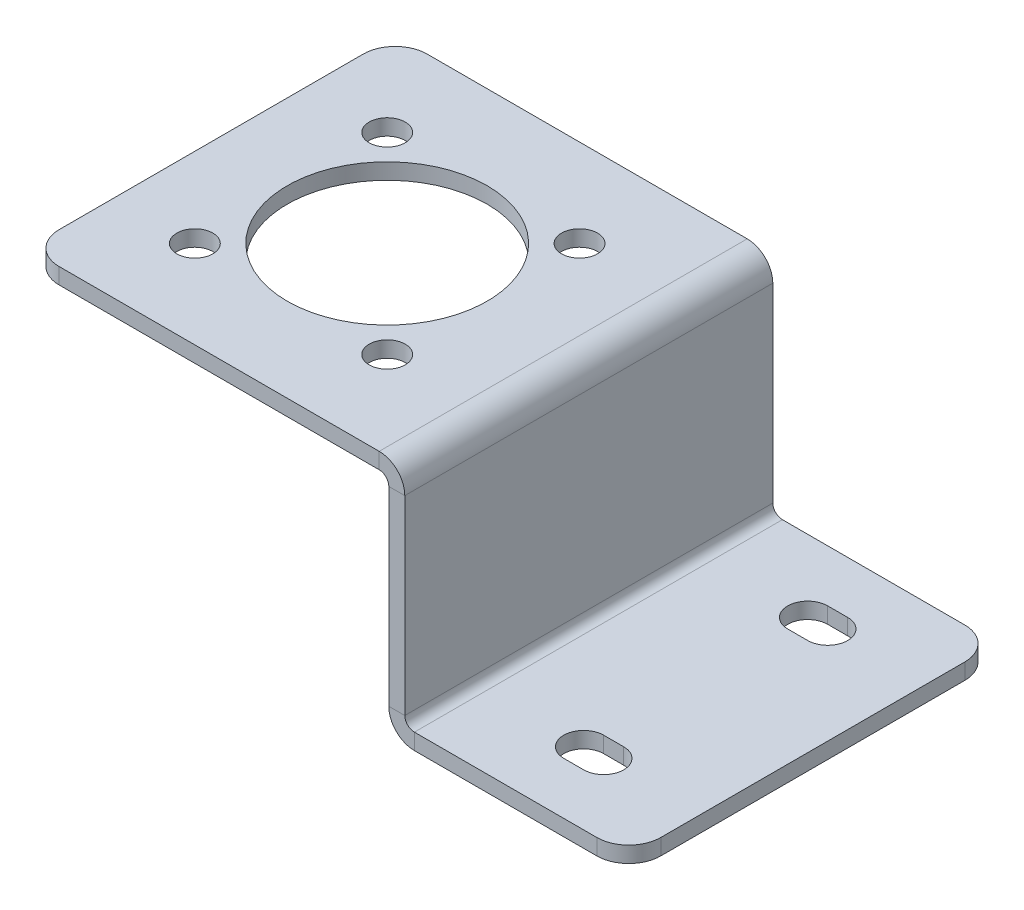
ISO-10303-21;
HEADER;
FILE_DESCRIPTION(('STEP AP214'),'2;1');
FILE_NAME('part.step','',(''),(''),'','','');
FILE_SCHEMA(('AUTOMOTIVE_DESIGN { 1 0 10303 214 1 1 1 1 }'));
ENDSEC;
DATA;
#1=APPLICATION_CONTEXT('core data for automotive mechanical design processes');
#2=APPLICATION_PROTOCOL_DEFINITION('international standard','automotive_design',2000,#1);
#3=PRODUCT_CONTEXT('',#1,'mechanical');
#4=PRODUCT('Part','Part','',(#3));
#5=PRODUCT_RELATED_PRODUCT_CATEGORY('part','',(#4));
#6=PRODUCT_DEFINITION_FORMATION('','',#4);
#7=PRODUCT_DEFINITION_CONTEXT('part definition',#1,'design');
#8=PRODUCT_DEFINITION('design','',#6,#7);
#9=PRODUCT_DEFINITION_SHAPE('','',#8);
#10=(LENGTH_UNIT() NAMED_UNIT(*) SI_UNIT(.MILLI.,.METRE.));
#11=(NAMED_UNIT(*) PLANE_ANGLE_UNIT() SI_UNIT($,.RADIAN.));
#12=(NAMED_UNIT(*) SI_UNIT($,.STERADIAN.) SOLID_ANGLE_UNIT());
#13=UNCERTAINTY_MEASURE_WITH_UNIT(LENGTH_MEASURE(1.E-05),#10,'distance_accuracy_value','');
#14=(GEOMETRIC_REPRESENTATION_CONTEXT(3) GLOBAL_UNCERTAINTY_ASSIGNED_CONTEXT((#13)) GLOBAL_UNIT_ASSIGNED_CONTEXT((#10,
#11,#12)) REPRESENTATION_CONTEXT('',''));
#15=CARTESIAN_POINT('',(0.,0.,0.));
#16=DIRECTION('',(0.,0.,1.));
#17=DIRECTION('',(1.,0.,0.));
#18=AXIS2_PLACEMENT_3D('',#15,#16,#17);
#19=CARTESIAN_POINT('',(-22.,-2.,23.));
#20=DIRECTION('',(0.,0.,1.));
#21=DIRECTION('',(1.,0.,0.));
#22=AXIS2_PLACEMENT_3D('',#19,#20,#21);
#23=PLANE('',#22);
#24=DIRECTION('',(1.,0.,0.));
#25=VECTOR('',#24,1.);
#26=CARTESIAN_POINT('',(-22.,0.,23.));
#27=LINE('',#26,#25);
#28=CARTESIAN_POINT('',(-18.,0.,23.));
#29=VERTEX_POINT('',#28);
#30=CARTESIAN_POINT('',(22.,0.,23.));
#31=VERTEX_POINT('',#30);
#32=EDGE_CURVE('E503',#29,#31,#27,.T.);
#33=ORIENTED_EDGE('',*,*,#32,.F.);
#34=DIRECTION('',(0.,1.,0.));
#35=VECTOR('',#34,1.);
#36=CARTESIAN_POINT('',(-18.,-2.,23.));
#37=LINE('',#36,#35);
#38=CARTESIAN_POINT('',(-18.,-2.,23.));
#39=VERTEX_POINT('',#38);
#40=EDGE_CURVE('E13',#29,#39,#37,.F.);
#41=ORIENTED_EDGE('',*,*,#40,.T.);
#42=DIRECTION('',(1.,0.,0.));
#43=VECTOR('',#42,1.);
#44=CARTESIAN_POINT('',(-22.,-2.,23.));
#45=LINE('',#44,#43);
#46=CARTESIAN_POINT('',(22.,-2.,23.));
#47=VERTEX_POINT('',#46);
#48=EDGE_CURVE('E510',#39,#47,#45,.T.);
#49=ORIENTED_EDGE('',*,*,#48,.T.);
#50=DIRECTION('',(0.,1.,0.));
#51=VECTOR('',#50,1.);
#52=CARTESIAN_POINT('',(22.,-2.,23.));
#53=LINE('',#52,#51);
#54=EDGE_CURVE('E527',#47,#31,#53,.T.);
#55=ORIENTED_EDGE('',*,*,#54,.T.);
#56=EDGE_LOOP('',(#33,#41,#49,#55));
#57=FACE_BOUND('',#56,.T.);
#58=ADVANCED_FACE('F86',(#57),#23,.T.);
#59=CARTESIAN_POINT('',(-22.,-2.,-23.));
#60=DIRECTION('',(-1.,0.,0.));
#61=DIRECTION('',(0.,0.,1.));
#62=AXIS2_PLACEMENT_3D('',#59,#60,#61);
#63=PLANE('',#62);
#64=DIRECTION('',(0.,0.,1.));
#65=VECTOR('',#64,1.);
#66=CARTESIAN_POINT('',(-22.,0.,-23.));
#67=LINE('',#66,#65);
#68=CARTESIAN_POINT('',(-22.,0.,-19.));
#69=VERTEX_POINT('',#68);
#70=CARTESIAN_POINT('',(-22.,0.,19.));
#71=VERTEX_POINT('',#70);
#72=EDGE_CURVE('E521',#69,#71,#67,.T.);
#73=ORIENTED_EDGE('',*,*,#72,.F.);
#74=DIRECTION('',(0.,1.,0.));
#75=VECTOR('',#74,1.);
#76=CARTESIAN_POINT('',(-22.,-2.,-19.));
#77=LINE('',#76,#75);
#78=CARTESIAN_POINT('',(-22.,-2.,-19.));
#79=VERTEX_POINT('',#78);
#80=EDGE_CURVE('E574',#69,#79,#77,.F.);
#81=ORIENTED_EDGE('',*,*,#80,.T.);
#82=DIRECTION('',(0.,0.,1.));
#83=VECTOR('',#82,1.);
#84=CARTESIAN_POINT('',(-22.,-2.,-23.));
#85=LINE('',#84,#83);
#86=CARTESIAN_POINT('',(-22.,-2.,19.));
#87=VERTEX_POINT('',#86);
#88=EDGE_CURVE('E507',#79,#87,#85,.T.);
#89=ORIENTED_EDGE('',*,*,#88,.T.);
#90=DIRECTION('',(0.,1.,0.));
#91=VECTOR('',#90,1.);
#92=CARTESIAN_POINT('',(-22.,-2.,19.));
#93=LINE('',#92,#91);
#94=EDGE_CURVE('E570',#87,#71,#93,.T.);
#95=ORIENTED_EDGE('',*,*,#94,.T.);
#96=EDGE_LOOP('',(#73,#81,#89,#95));
#97=FACE_BOUND('',#96,.T.);
#98=ADVANCED_FACE('F596',(#97),#63,.T.);
#99=CARTESIAN_POINT('',(-22.,-2.,-23.));
#100=DIRECTION('',(0.,0.,-1.));
#101=DIRECTION('',(-1.,0.,0.));
#102=AXIS2_PLACEMENT_3D('',#99,#100,#101);
#103=PLANE('',#102);
#104=DIRECTION('',(-1.,0.,0.));
#105=VECTOR('',#104,1.);
#106=CARTESIAN_POINT('',(-22.,-2.,-23.));
#107=LINE('',#106,#105);
#108=CARTESIAN_POINT('',(22.,-2.,-23.));
#109=VERTEX_POINT('',#108);
#110=CARTESIAN_POINT('',(-18.,-2.,-23.));
#111=VERTEX_POINT('',#110);
#112=EDGE_CURVE('E502',#109,#111,#107,.T.);
#113=ORIENTED_EDGE('',*,*,#112,.T.);
#114=DIRECTION('',(0.,1.,0.));
#115=VECTOR('',#114,1.);
#116=CARTESIAN_POINT('',(-18.,-2.,-23.));
#117=LINE('',#116,#115);
#118=CARTESIAN_POINT('',(-18.,0.,-23.));
#119=VERTEX_POINT('',#118);
#120=EDGE_CURVE('E560',#111,#119,#117,.T.);
#121=ORIENTED_EDGE('',*,*,#120,.T.);
#122=DIRECTION('',(-1.,0.,0.));
#123=VECTOR('',#122,1.);
#124=CARTESIAN_POINT('',(-22.,0.,-23.));
#125=LINE('',#124,#123);
#126=CARTESIAN_POINT('',(22.,0.,-23.));
#127=VERTEX_POINT('',#126);
#128=EDGE_CURVE('E517',#127,#119,#125,.T.);
#129=ORIENTED_EDGE('',*,*,#128,.F.);
#130=DIRECTION('',(0.,1.,0.));
#131=VECTOR('',#130,1.);
#132=CARTESIAN_POINT('',(22.,-2.,-23.));
#133=LINE('',#132,#131);
#134=EDGE_CURVE('E513',#109,#127,#133,.T.);
#135=ORIENTED_EDGE('',*,*,#134,.F.);
#136=EDGE_LOOP('',(#113,#121,#129,#135));
#137=FACE_BOUND('',#136,.T.);
#138=ADVANCED_FACE('F589',(#137),#103,.T.);
#139=CARTESIAN_POINT('',(0.,-2.,0.));
#140=DIRECTION('',(0.,1.,0.));
#141=DIRECTION('',(0.,0.,1.));
#142=AXIS2_PLACEMENT_3D('',#139,#140,#141);
#143=PLANE('',#142);
#144=CARTESIAN_POINT('',(-12.0208152801708,-2.,-12.0208152801701));
#145=DIRECTION('',(0.,1.,0.));
#146=DIRECTION('',(0.,0.,1.));
#147=AXIS2_PLACEMENT_3D('',#144,#145,#146);
#148=CIRCLE('',#147,2.25000000000102);
#149=CARTESIAN_POINT('',(-12.0208152801708,-2.,-9.77081528016909));
#150=VERTEX_POINT('',#149);
#151=EDGE_CURVE('E459',#150,#150,#148,.T.);
#152=ORIENTED_EDGE('',*,*,#151,.T.);
#153=EDGE_LOOP('',(#152));
#154=FACE_BOUND('',#153,.T.);
#155=CARTESIAN_POINT('',(-12.0208152801684,-2.,12.0208152801725));
#156=DIRECTION('',(0.,1.,0.));
#157=DIRECTION('',(0.,0.,1.));
#158=AXIS2_PLACEMENT_3D('',#155,#156,#157);
#159=CIRCLE('',#158,2.25000000000325);
#160=CARTESIAN_POINT('',(-12.0208152801684,-2.,14.2708152801758));
#161=VERTEX_POINT('',#160);
#162=EDGE_CURVE('E467',#161,#161,#159,.T.);
#163=ORIENTED_EDGE('',*,*,#162,.T.);
#164=EDGE_LOOP('',(#163));
#165=FACE_BOUND('',#164,.T.);
#166=CARTESIAN_POINT('',(12.0208152801742,-2.,12.0208152801701));
#167=DIRECTION('',(0.,1.,0.));
#168=DIRECTION('',(0.,0.,1.));
#169=AXIS2_PLACEMENT_3D('',#166,#167,#168);
#170=CIRCLE('',#169,2.25000000000249);
#171=CARTESIAN_POINT('',(12.0208152801742,-2.,14.2708152801726));
#172=VERTEX_POINT('',#171);
#173=EDGE_CURVE('E475',#172,#172,#170,.T.);
#174=ORIENTED_EDGE('',*,*,#173,.T.);
#175=EDGE_LOOP('',(#174));
#176=FACE_BOUND('',#175,.T.);
#177=CARTESIAN_POINT('',(12.0208152801718,-2.,-12.0208152801725));
#178=DIRECTION('',(0.,1.,0.));
#179=DIRECTION('',(0.,0.,1.));
#180=AXIS2_PLACEMENT_3D('',#177,#178,#179);
#181=CIRCLE('',#180,2.25000000000015);
#182=CARTESIAN_POINT('',(12.0208152801718,-2.,-9.77081528017235));
#183=VERTEX_POINT('',#182);
#184=EDGE_CURVE('E483',#183,#183,#181,.T.);
#185=ORIENTED_EDGE('',*,*,#184,.T.);
#186=EDGE_LOOP('',(#185));
#187=FACE_BOUND('',#186,.T.);
#188=CARTESIAN_POINT('',(0.,-2.,0.));
#189=DIRECTION('',(0.,1.,0.));
#190=DIRECTION('',(0.,0.,1.));
#191=AXIS2_PLACEMENT_3D('',#188,#189,#190);
#192=CIRCLE('',#191,12.5);
#193=CARTESIAN_POINT('',(0.,-2.,12.5));
#194=VERTEX_POINT('',#193);
#195=EDGE_CURVE('E491',#194,#194,#192,.T.);
#196=ORIENTED_EDGE('',*,*,#195,.T.);
#197=EDGE_LOOP('',(#196));
#198=FACE_BOUND('',#197,.T.);
#199=ORIENTED_EDGE('',*,*,#88,.F.);
#200=CARTESIAN_POINT('',(-18.,-2.,-19.));
#201=DIRECTION('',(0.,1.,0.));
#202=DIRECTION('',(0.,0.,1.));
#203=AXIS2_PLACEMENT_3D('',#200,#201,#202);
#204=CIRCLE('',#203,4.);
#205=EDGE_CURVE('E95',#79,#111,#204,.F.);
#206=ORIENTED_EDGE('',*,*,#205,.T.);
#207=ORIENTED_EDGE('',*,*,#112,.F.);
#208=DIRECTION('',(0.,0.,-1.));
#209=VECTOR('',#208,1.);
#210=CARTESIAN_POINT('',(22.,-2.,-23.));
#211=LINE('',#210,#209);
#212=EDGE_CURVE('E499',#47,#109,#211,.T.);
#213=ORIENTED_EDGE('',*,*,#212,.F.);
#214=ORIENTED_EDGE('',*,*,#48,.F.);
#215=CARTESIAN_POINT('',(-18.,-2.,19.));
#216=DIRECTION('',(0.,1.,0.));
#217=DIRECTION('',(0.,0.,1.));
#218=AXIS2_PLACEMENT_3D('',#215,#216,#217);
#219=CIRCLE('',#218,4.);
#220=EDGE_CURVE('E107',#39,#87,#219,.F.);
#221=ORIENTED_EDGE('',*,*,#220,.T.);
#222=EDGE_LOOP('',(#199,#206,#207,#213,#214,#221));
#223=FACE_BOUND('',#222,.T.);
#224=ADVANCED_FACE('F582',(#154,#165,#176,#187,#198,#223),#143,.F.);
#225=CARTESIAN_POINT('',(0.,0.,0.));
#226=DIRECTION('',(0.,1.,0.));
#227=DIRECTION('',(0.,0.,1.));
#228=AXIS2_PLACEMENT_3D('',#225,#226,#227);
#229=PLANE('',#228);
#230=CARTESIAN_POINT('',(-12.0208152801708,0.,-12.0208152801701));
#231=DIRECTION('',(0.,1.,0.));
#232=DIRECTION('',(0.,0.,1.));
#233=AXIS2_PLACEMENT_3D('',#230,#231,#232);
#234=CIRCLE('',#233,2.25000000000102);
#235=CARTESIAN_POINT('',(-12.0208152801708,0.,-9.77081528016909));
#236=VERTEX_POINT('',#235);
#237=EDGE_CURVE('E447',#236,#236,#234,.T.);
#238=ORIENTED_EDGE('',*,*,#237,.F.);
#239=EDGE_LOOP('',(#238));
#240=FACE_BOUND('',#239,.T.);
#241=CARTESIAN_POINT('',(-12.0208152801684,0.,12.0208152801725));
#242=DIRECTION('',(0.,1.,0.));
#243=DIRECTION('',(0.,0.,1.));
#244=AXIS2_PLACEMENT_3D('',#241,#242,#243);
#245=CIRCLE('',#244,2.25000000000325);
#246=CARTESIAN_POINT('',(-12.0208152801684,0.,14.2708152801758));
#247=VERTEX_POINT('',#246);
#248=EDGE_CURVE('E463',#247,#247,#245,.T.);
#249=ORIENTED_EDGE('',*,*,#248,.F.);
#250=EDGE_LOOP('',(#249));
#251=FACE_BOUND('',#250,.T.);
#252=CARTESIAN_POINT('',(12.0208152801742,0.,12.0208152801701));
#253=DIRECTION('',(0.,1.,0.));
#254=DIRECTION('',(0.,0.,1.));
#255=AXIS2_PLACEMENT_3D('',#252,#253,#254);
#256=CIRCLE('',#255,2.25000000000249);
#257=CARTESIAN_POINT('',(12.0208152801742,0.,14.2708152801726));
#258=VERTEX_POINT('',#257);
#259=EDGE_CURVE('E471',#258,#258,#256,.T.);
#260=ORIENTED_EDGE('',*,*,#259,.F.);
#261=EDGE_LOOP('',(#260));
#262=FACE_BOUND('',#261,.T.);
#263=CARTESIAN_POINT('',(12.0208152801718,0.,-12.0208152801725));
#264=DIRECTION('',(0.,1.,0.));
#265=DIRECTION('',(0.,0.,1.));
#266=AXIS2_PLACEMENT_3D('',#263,#264,#265);
#267=CIRCLE('',#266,2.25000000000015);
#268=CARTESIAN_POINT('',(12.0208152801718,0.,-9.77081528017235));
#269=VERTEX_POINT('',#268);
#270=EDGE_CURVE('E479',#269,#269,#267,.T.);
#271=ORIENTED_EDGE('',*,*,#270,.F.);
#272=EDGE_LOOP('',(#271));
#273=FACE_BOUND('',#272,.T.);
#274=CARTESIAN_POINT('',(0.,0.,0.));
#275=DIRECTION('',(0.,1.,0.));
#276=DIRECTION('',(0.,0.,1.));
#277=AXIS2_PLACEMENT_3D('',#274,#275,#276);
#278=CIRCLE('',#277,12.5);
#279=CARTESIAN_POINT('',(0.,0.,12.5));
#280=VERTEX_POINT('',#279);
#281=EDGE_CURVE('E487',#280,#280,#278,.T.);
#282=ORIENTED_EDGE('',*,*,#281,.F.);
#283=EDGE_LOOP('',(#282));
#284=FACE_BOUND('',#283,.T.);
#285=ORIENTED_EDGE('',*,*,#128,.T.);
#286=CARTESIAN_POINT('',(-18.,0.,-19.));
#287=DIRECTION('',(0.,1.,0.));
#288=DIRECTION('',(0.,0.,1.));
#289=AXIS2_PLACEMENT_3D('',#286,#287,#288);
#290=CIRCLE('',#289,4.);
#291=EDGE_CURVE('E567',#119,#69,#290,.T.);
#292=ORIENTED_EDGE('',*,*,#291,.T.);
#293=ORIENTED_EDGE('',*,*,#72,.T.);
#294=CARTESIAN_POINT('',(-18.,0.,19.));
#295=DIRECTION('',(0.,1.,0.));
#296=DIRECTION('',(0.,0.,1.));
#297=AXIS2_PLACEMENT_3D('',#294,#295,#296);
#298=CIRCLE('',#297,4.);
#299=EDGE_CURVE('E564',#71,#29,#298,.T.);
#300=ORIENTED_EDGE('',*,*,#299,.T.);
#301=ORIENTED_EDGE('',*,*,#32,.T.);
#302=DIRECTION('',(0.,0.,-1.));
#303=VECTOR('',#302,1.);
#304=CARTESIAN_POINT('',(22.,0.,-23.));
#305=LINE('',#304,#303);
#306=EDGE_CURVE('E495',#31,#127,#305,.T.);
#307=ORIENTED_EDGE('',*,*,#306,.T.);
#308=EDGE_LOOP('',(#285,#292,#293,#300,#301,#307));
#309=FACE_BOUND('',#308,.T.);
#310=ADVANCED_FACE('F594',(#240,#251,#262,#273,#284,#309),#229,.T.);
#311=CARTESIAN_POINT('',(0.,-2.,0.));
#312=DIRECTION('',(0.,1.,0.));
#313=DIRECTION('',(0.,0.,1.));
#314=AXIS2_PLACEMENT_3D('',#311,#312,#313);
#315=CYLINDRICAL_SURFACE('',#314,12.5);
#316=ORIENTED_EDGE('',*,*,#195,.F.);
#317=EDGE_LOOP('',(#316));
#318=FACE_BOUND('',#317,.T.);
#319=ORIENTED_EDGE('',*,*,#281,.T.);
#320=EDGE_LOOP('',(#319));
#321=FACE_BOUND('',#320,.T.);
#322=ADVANCED_FACE('F959',(#318,#321),#315,.F.);
#323=CARTESIAN_POINT('',(12.0208152801718,-2.,-12.0208152801725));
#324=DIRECTION('',(0.,1.,0.));
#325=DIRECTION('',(0.,0.,1.));
#326=AXIS2_PLACEMENT_3D('',#323,#324,#325);
#327=CYLINDRICAL_SURFACE('',#326,2.25000000000015);
#328=ORIENTED_EDGE('',*,*,#184,.F.);
#329=EDGE_LOOP('',(#328));
#330=FACE_BOUND('',#329,.T.);
#331=ORIENTED_EDGE('',*,*,#270,.T.);
#332=EDGE_LOOP('',(#331));
#333=FACE_BOUND('',#332,.T.);
#334=ADVANCED_FACE('F949',(#330,#333),#327,.F.);
#335=CARTESIAN_POINT('',(12.0208152801742,-2.,12.0208152801701));
#336=DIRECTION('',(0.,1.,0.));
#337=DIRECTION('',(0.,0.,1.));
#338=AXIS2_PLACEMENT_3D('',#335,#336,#337);
#339=CYLINDRICAL_SURFACE('',#338,2.25000000000249);
#340=ORIENTED_EDGE('',*,*,#173,.F.);
#341=EDGE_LOOP('',(#340));
#342=FACE_BOUND('',#341,.T.);
#343=ORIENTED_EDGE('',*,*,#259,.T.);
#344=EDGE_LOOP('',(#343));
#345=FACE_BOUND('',#344,.T.);
#346=ADVANCED_FACE('F939',(#342,#345),#339,.F.);
#347=CARTESIAN_POINT('',(-12.0208152801684,-2.,12.0208152801725));
#348=DIRECTION('',(0.,1.,0.));
#349=DIRECTION('',(0.,0.,1.));
#350=AXIS2_PLACEMENT_3D('',#347,#348,#349);
#351=CYLINDRICAL_SURFACE('',#350,2.25000000000325);
#352=ORIENTED_EDGE('',*,*,#162,.F.);
#353=EDGE_LOOP('',(#352));
#354=FACE_BOUND('',#353,.T.);
#355=ORIENTED_EDGE('',*,*,#248,.T.);
#356=EDGE_LOOP('',(#355));
#357=FACE_BOUND('',#356,.T.);
#358=ADVANCED_FACE('F929',(#354,#357),#351,.F.);
#359=CARTESIAN_POINT('',(-12.0208152801708,-2.,-12.0208152801701));
#360=DIRECTION('',(0.,1.,0.));
#361=DIRECTION('',(0.,0.,1.));
#362=AXIS2_PLACEMENT_3D('',#359,#360,#361);
#363=CYLINDRICAL_SURFACE('',#362,2.25000000000102);
#364=ORIENTED_EDGE('',*,*,#151,.F.);
#365=EDGE_LOOP('',(#364));
#366=FACE_BOUND('',#365,.T.);
#367=ORIENTED_EDGE('',*,*,#237,.T.);
#368=EDGE_LOOP('',(#367));
#369=FACE_BOUND('',#368,.T.);
#370=ADVANCED_FACE('F919',(#366,#369),#363,.F.);
#371=CARTESIAN_POINT('',(22.,-3.2,-23.));
#372=DIRECTION('',(0.,0.,-1.));
#373=DIRECTION('',(-1.,0.,0.));
#374=AXIS2_PLACEMENT_3D('',#371,#372,#373);
#375=PLANE('',#374);
#376=DIRECTION('',(-1.,0.,0.));
#377=VECTOR('',#376,1.);
#378=CARTESIAN_POINT('',(25.2,-3.19999999999999,-23.));
#379=LINE('',#378,#377);
#380=CARTESIAN_POINT('',(23.2,-3.2,-23.));
#381=VERTEX_POINT('',#380);
#382=CARTESIAN_POINT('',(25.2,-3.19999999999999,-23.));
#383=VERTEX_POINT('',#382);
#384=EDGE_CURVE('E388',#381,#383,#379,.F.);
#385=ORIENTED_EDGE('',*,*,#384,.F.);
#386=CARTESIAN_POINT('',(22.,-3.2,-23.));
#387=DIRECTION('',(0.,0.,1.));
#388=DIRECTION('',(1.,0.,0.));
#389=AXIS2_PLACEMENT_3D('',#386,#387,#388);
#390=CIRCLE('',#389,1.2);
#391=EDGE_CURVE('E452',#109,#381,#390,.F.);
#392=ORIENTED_EDGE('',*,*,#391,.F.);
#393=ORIENTED_EDGE('',*,*,#134,.T.);
#394=CARTESIAN_POINT('',(22.,-3.2,-23.));
#395=DIRECTION('',(0.,0.,1.));
#396=DIRECTION('',(1.,0.,0.));
#397=AXIS2_PLACEMENT_3D('',#394,#395,#396);
#398=CIRCLE('',#397,3.2);
#399=EDGE_CURVE('E443',#127,#383,#398,.F.);
#400=ORIENTED_EDGE('',*,*,#399,.T.);
#401=EDGE_LOOP('',(#385,#392,#393,#400));
#402=FACE_BOUND('',#401,.T.);
#403=ADVANCED_FACE('F910',(#402),#375,.T.);
#404=CARTESIAN_POINT('',(22.,-3.2,23.));
#405=DIRECTION('',(0.,0.,-1.));
#406=DIRECTION('',(-1.,0.,0.));
#407=AXIS2_PLACEMENT_3D('',#404,#405,#406);
#408=PLANE('',#407);
#409=CARTESIAN_POINT('',(22.,-3.2,23.));
#410=DIRECTION('',(0.,0.,1.));
#411=DIRECTION('',(1.,0.,0.));
#412=AXIS2_PLACEMENT_3D('',#409,#410,#411);
#413=CIRCLE('',#412,1.2);
#414=CARTESIAN_POINT('',(23.2,-3.2,23.));
#415=VERTEX_POINT('',#414);
#416=EDGE_CURVE('E404',#415,#47,#413,.T.);
#417=ORIENTED_EDGE('',*,*,#416,.F.);
#418=DIRECTION('',(-1.,0.,0.));
#419=VECTOR('',#418,1.);
#420=CARTESIAN_POINT('',(23.2,-3.2,23.));
#421=LINE('',#420,#419);
#422=CARTESIAN_POINT('',(25.2,-3.19999999999999,23.));
#423=VERTEX_POINT('',#422);
#424=EDGE_CURVE('E433',#415,#423,#421,.F.);
#425=ORIENTED_EDGE('',*,*,#424,.T.);
#426=CARTESIAN_POINT('',(22.,-3.2,23.));
#427=DIRECTION('',(0.,0.,1.));
#428=DIRECTION('',(1.,0.,0.));
#429=AXIS2_PLACEMENT_3D('',#426,#427,#428);
#430=CIRCLE('',#429,3.2);
#431=EDGE_CURVE('E448',#423,#31,#430,.T.);
#432=ORIENTED_EDGE('',*,*,#431,.T.);
#433=ORIENTED_EDGE('',*,*,#54,.F.);
#434=EDGE_LOOP('',(#417,#425,#432,#433));
#435=FACE_BOUND('',#434,.T.);
#436=ADVANCED_FACE('F603',(#435),#408,.F.);
#437=CARTESIAN_POINT('',(22.,-3.2,23.));
#438=DIRECTION('',(0.,0.,1.));
#439=DIRECTION('',(1.,0.,0.));
#440=AXIS2_PLACEMENT_3D('',#437,#438,#439);
#441=CYLINDRICAL_SURFACE('',#440,3.2);
#442=ORIENTED_EDGE('',*,*,#306,.F.);
#443=ORIENTED_EDGE('',*,*,#431,.F.);
#444=DIRECTION('',(0.,0.,1.));
#445=VECTOR('',#444,1.);
#446=CARTESIAN_POINT('',(25.2,-3.19999999999999,-23.));
#447=LINE('',#446,#445);
#448=EDGE_CURVE('E430',#423,#383,#447,.F.);
#449=ORIENTED_EDGE('',*,*,#448,.T.);
#450=ORIENTED_EDGE('',*,*,#399,.F.);
#451=EDGE_LOOP('',(#442,#443,#449,#450));
#452=FACE_BOUND('',#451,.T.);
#453=ADVANCED_FACE('F892',(#452),#441,.T.);
#454=CARTESIAN_POINT('',(22.,-3.2,23.));
#455=DIRECTION('',(0.,0.,1.));
#456=DIRECTION('',(1.,0.,0.));
#457=AXIS2_PLACEMENT_3D('',#454,#455,#456);
#458=CYLINDRICAL_SURFACE('',#457,1.2);
#459=ORIENTED_EDGE('',*,*,#212,.T.);
#460=ORIENTED_EDGE('',*,*,#391,.T.);
#461=DIRECTION('',(0.,0.,1.));
#462=VECTOR('',#461,1.);
#463=CARTESIAN_POINT('',(23.2,-3.2,-23.));
#464=LINE('',#463,#462);
#465=EDGE_CURVE('E437',#381,#415,#464,.T.);
#466=ORIENTED_EDGE('',*,*,#465,.T.);
#467=ORIENTED_EDGE('',*,*,#416,.T.);
#468=EDGE_LOOP('',(#459,#460,#466,#467));
#469=FACE_BOUND('',#468,.T.);
#470=ADVANCED_FACE('F606',(#469),#458,.F.);
#471=CARTESIAN_POINT('',(25.2000000000001,-27.,23.));
#472=DIRECTION('',(0.,0.,-1.));
#473=DIRECTION('',(-1.,0.,0.));
#474=AXIS2_PLACEMENT_3D('',#471,#472,#473);
#475=PLANE('',#474);
#476=ORIENTED_EDGE('',*,*,#424,.F.);
#477=DIRECTION('',(0.,1.,0.));
#478=VECTOR('',#477,1.);
#479=CARTESIAN_POINT('',(23.2000000000001,-27.,23.));
#480=LINE('',#479,#478);
#481=CARTESIAN_POINT('',(23.2000000000001,-27.,23.));
#482=VERTEX_POINT('',#481);
#483=EDGE_CURVE('E427',#415,#482,#480,.F.);
#484=ORIENTED_EDGE('',*,*,#483,.T.);
#485=DIRECTION('',(-1.,0.,0.));
#486=VECTOR('',#485,1.);
#487=CARTESIAN_POINT('',(25.2000000000001,-27.,23.));
#488=LINE('',#487,#486);
#489=CARTESIAN_POINT('',(25.2000000000001,-27.,23.));
#490=VERTEX_POINT('',#489);
#491=EDGE_CURVE('E400',#490,#482,#488,.T.);
#492=ORIENTED_EDGE('',*,*,#491,.F.);
#493=DIRECTION('',(0.,-1.,0.));
#494=VECTOR('',#493,1.);
#495=CARTESIAN_POINT('',(25.2,0.,23.));
#496=LINE('',#495,#494);
#497=EDGE_CURVE('E416',#423,#490,#496,.T.);
#498=ORIENTED_EDGE('',*,*,#497,.F.);
#499=EDGE_LOOP('',(#476,#484,#492,#498));
#500=FACE_BOUND('',#499,.T.);
#501=ADVANCED_FACE('F874',(#500),#475,.F.);
#502=CARTESIAN_POINT('',(25.2,-1.99999999999999,-23.));
#503=DIRECTION('',(0.,0.,1.));
#504=DIRECTION('',(1.,0.,0.));
#505=AXIS2_PLACEMENT_3D('',#502,#503,#504);
#506=PLANE('',#505);
#507=ORIENTED_EDGE('',*,*,#384,.T.);
#508=DIRECTION('',(0.,1.,0.));
#509=VECTOR('',#508,1.);
#510=CARTESIAN_POINT('',(25.2,0.,-23.));
#511=LINE('',#510,#509);
#512=CARTESIAN_POINT('',(25.2000000000001,-27.,-23.));
#513=VERTEX_POINT('',#512);
#514=EDGE_CURVE('E409',#513,#383,#511,.T.);
#515=ORIENTED_EDGE('',*,*,#514,.F.);
#516=DIRECTION('',(-1.,0.,0.));
#517=VECTOR('',#516,1.);
#518=CARTESIAN_POINT('',(25.2000000000001,-27.,-23.));
#519=LINE('',#518,#517);
#520=CARTESIAN_POINT('',(23.2000000000001,-27.,-23.));
#521=VERTEX_POINT('',#520);
#522=EDGE_CURVE('E405',#513,#521,#519,.T.);
#523=ORIENTED_EDGE('',*,*,#522,.T.);
#524=DIRECTION('',(0.,-1.,0.));
#525=VECTOR('',#524,1.);
#526=CARTESIAN_POINT('',(23.2,-2.,-23.));
#527=LINE('',#526,#525);
#528=EDGE_CURVE('E419',#521,#381,#527,.F.);
#529=ORIENTED_EDGE('',*,*,#528,.T.);
#530=EDGE_LOOP('',(#507,#515,#523,#529));
#531=FACE_BOUND('',#530,.T.);
#532=ADVANCED_FACE('F614',(#531),#506,.F.);
#533=CARTESIAN_POINT('',(25.2,0.,0.));
#534=DIRECTION('',(-1.,0.,0.));
#535=DIRECTION('',(0.,-1.,0.));
#536=AXIS2_PLACEMENT_3D('',#533,#534,#535);
#537=PLANE('',#536);
#538=ORIENTED_EDGE('',*,*,#448,.F.);
#539=ORIENTED_EDGE('',*,*,#497,.T.);
#540=DIRECTION('',(0.,0.,-1.));
#541=VECTOR('',#540,1.);
#542=CARTESIAN_POINT('',(25.2000000000001,-27.,0.));
#543=LINE('',#542,#541);
#544=EDGE_CURVE('E413',#490,#513,#543,.T.);
#545=ORIENTED_EDGE('',*,*,#544,.T.);
#546=ORIENTED_EDGE('',*,*,#514,.T.);
#547=EDGE_LOOP('',(#538,#539,#545,#546));
#548=FACE_BOUND('',#547,.T.);
#549=ADVANCED_FACE('F856',(#548),#537,.F.);
#550=CARTESIAN_POINT('',(23.2,0.,0.));
#551=DIRECTION('',(-1.,0.,0.));
#552=DIRECTION('',(0.,-1.,0.));
#553=AXIS2_PLACEMENT_3D('',#550,#551,#552);
#554=PLANE('',#553);
#555=ORIENTED_EDGE('',*,*,#483,.F.);
#556=ORIENTED_EDGE('',*,*,#465,.F.);
#557=ORIENTED_EDGE('',*,*,#528,.F.);
#558=DIRECTION('',(0.,0.,1.));
#559=VECTOR('',#558,1.);
#560=CARTESIAN_POINT('',(23.2000000000001,-27.,-23.));
#561=LINE('',#560,#559);
#562=EDGE_CURVE('E423',#482,#521,#561,.F.);
#563=ORIENTED_EDGE('',*,*,#562,.F.);
#564=EDGE_LOOP('',(#555,#556,#557,#563));
#565=FACE_BOUND('',#564,.T.);
#566=ADVANCED_FACE('F611',(#565),#554,.T.);
#567=CARTESIAN_POINT('',(26.4000000000001,-27.,23.));
#568=DIRECTION('',(0.,0.,1.));
#569=DIRECTION('',(1.,0.,0.));
#570=AXIS2_PLACEMENT_3D('',#567,#568,#569);
#571=PLANE('',#570);
#572=DIRECTION('',(0.,1.,0.));
#573=VECTOR('',#572,1.);
#574=CARTESIAN_POINT('',(26.4000000000001,-30.2,23.));
#575=LINE('',#574,#573);
#576=CARTESIAN_POINT('',(26.4000000000001,-28.2,23.));
#577=VERTEX_POINT('',#576);
#578=CARTESIAN_POINT('',(26.4000000000001,-30.2,23.));
#579=VERTEX_POINT('',#578);
#580=EDGE_CURVE('E270',#577,#579,#575,.F.);
#581=ORIENTED_EDGE('',*,*,#580,.F.);
#582=CARTESIAN_POINT('',(26.4000000000001,-27.,23.));
#583=DIRECTION('',(0.,0.,-1.));
#584=DIRECTION('',(-1.,0.,0.));
#585=AXIS2_PLACEMENT_3D('',#582,#583,#584);
#586=CIRCLE('',#585,1.2);
#587=EDGE_CURVE('E393',#490,#577,#586,.F.);
#588=ORIENTED_EDGE('',*,*,#587,.F.);
#589=ORIENTED_EDGE('',*,*,#491,.T.);
#590=CARTESIAN_POINT('',(26.4000000000001,-27.,23.));
#591=DIRECTION('',(0.,0.,-1.));
#592=DIRECTION('',(-1.,0.,0.));
#593=AXIS2_PLACEMENT_3D('',#590,#591,#592);
#594=CIRCLE('',#593,3.2);
#595=EDGE_CURVE('E384',#482,#579,#594,.F.);
#596=ORIENTED_EDGE('',*,*,#595,.T.);
#597=EDGE_LOOP('',(#581,#588,#589,#596));
#598=FACE_BOUND('',#597,.T.);
#599=ADVANCED_FACE('F651',(#598),#571,.T.);
#600=CARTESIAN_POINT('',(26.4000000000001,-27.,-23.));
#601=DIRECTION('',(0.,0.,1.));
#602=DIRECTION('',(1.,0.,0.));
#603=AXIS2_PLACEMENT_3D('',#600,#601,#602);
#604=PLANE('',#603);
#605=CARTESIAN_POINT('',(26.4000000000001,-27.,-23.));
#606=DIRECTION('',(0.,0.,-1.));
#607=DIRECTION('',(-1.,0.,0.));
#608=AXIS2_PLACEMENT_3D('',#605,#606,#607);
#609=CIRCLE('',#608,1.2);
#610=CARTESIAN_POINT('',(26.4000000000001,-28.2,-23.));
#611=VERTEX_POINT('',#610);
#612=EDGE_CURVE('E351',#611,#513,#609,.T.);
#613=ORIENTED_EDGE('',*,*,#612,.F.);
#614=DIRECTION('',(0.,1.,0.));
#615=VECTOR('',#614,1.);
#616=CARTESIAN_POINT('',(26.4000000000001,-28.2,-23.));
#617=LINE('',#616,#615);
#618=CARTESIAN_POINT('',(26.4000000000001,-30.2,-23.));
#619=VERTEX_POINT('',#618);
#620=EDGE_CURVE('E374',#611,#619,#617,.F.);
#621=ORIENTED_EDGE('',*,*,#620,.T.);
#622=CARTESIAN_POINT('',(26.4000000000001,-27.,-23.));
#623=DIRECTION('',(0.,0.,-1.));
#624=DIRECTION('',(-1.,0.,0.));
#625=AXIS2_PLACEMENT_3D('',#622,#623,#624);
#626=CIRCLE('',#625,3.2);
#627=EDGE_CURVE('E389',#619,#521,#626,.T.);
#628=ORIENTED_EDGE('',*,*,#627,.T.);
#629=ORIENTED_EDGE('',*,*,#522,.F.);
#630=EDGE_LOOP('',(#613,#621,#628,#629));
#631=FACE_BOUND('',#630,.T.);
#632=ADVANCED_FACE('F622',(#631),#604,.F.);
#633=CARTESIAN_POINT('',(26.4000000000001,-27.,-23.));
#634=DIRECTION('',(0.,0.,-1.));
#635=DIRECTION('',(0.,-1.,0.));
#636=AXIS2_PLACEMENT_3D('',#633,#634,#635);
#637=CYLINDRICAL_SURFACE('',#636,3.2);
#638=ORIENTED_EDGE('',*,*,#562,.T.);
#639=ORIENTED_EDGE('',*,*,#627,.F.);
#640=DIRECTION('',(0.,0.,-1.));
#641=VECTOR('',#640,1.);
#642=CARTESIAN_POINT('',(26.4000000000001,-30.2,23.));
#643=LINE('',#642,#641);
#644=EDGE_CURVE('E370',#619,#579,#643,.F.);
#645=ORIENTED_EDGE('',*,*,#644,.T.);
#646=ORIENTED_EDGE('',*,*,#595,.F.);
#647=EDGE_LOOP('',(#638,#639,#645,#646));
#648=FACE_BOUND('',#647,.T.);
#649=ADVANCED_FACE('F621',(#648),#637,.T.);
#650=CARTESIAN_POINT('',(26.4000000000001,-27.,-23.));
#651=DIRECTION('',(0.,0.,-1.));
#652=DIRECTION('',(0.,-1.,0.));
#653=AXIS2_PLACEMENT_3D('',#650,#651,#652);
#654=CYLINDRICAL_SURFACE('',#653,1.2);
#655=ORIENTED_EDGE('',*,*,#544,.F.);
#656=ORIENTED_EDGE('',*,*,#587,.T.);
#657=DIRECTION('',(0.,0.,-1.));
#658=VECTOR('',#657,1.);
#659=CARTESIAN_POINT('',(26.4000000000001,-28.2,23.));
#660=LINE('',#659,#658);
#661=EDGE_CURVE('E378',#577,#611,#660,.T.);
#662=ORIENTED_EDGE('',*,*,#661,.T.);
#663=ORIENTED_EDGE('',*,*,#612,.T.);
#664=EDGE_LOOP('',(#655,#656,#662,#663));
#665=FACE_BOUND('',#664,.T.);
#666=ADVANCED_FACE('F655',(#665),#654,.F.);
#667=CARTESIAN_POINT('',(25.2000000000001,-30.2,23.));
#668=DIRECTION('',(0.,0.,-1.));
#669=DIRECTION('',(-1.,0.,0.));
#670=AXIS2_PLACEMENT_3D('',#667,#668,#669);
#671=PLANE('',#670);
#672=DIRECTION('',(-1.,0.,0.));
#673=VECTOR('',#672,1.);
#674=CARTESIAN_POINT('',(0.,-30.2,23.));
#675=LINE('',#674,#673);
#676=CARTESIAN_POINT('',(49.2000000000001,-30.2,23.));
#677=VERTEX_POINT('',#676);
#678=EDGE_CURVE('E356',#677,#579,#675,.T.);
#679=ORIENTED_EDGE('',*,*,#678,.F.);
#680=DIRECTION('',(0.,1.,0.));
#681=VECTOR('',#680,1.);
#682=CARTESIAN_POINT('',(49.2000000000001,-30.2,23.));
#683=LINE('',#682,#681);
#684=CARTESIAN_POINT('',(49.2000000000001,-28.2,23.));
#685=VERTEX_POINT('',#684);
#686=EDGE_CURVE('E556',#677,#685,#683,.T.);
#687=ORIENTED_EDGE('',*,*,#686,.T.);
#688=DIRECTION('',(1.,0.,0.));
#689=VECTOR('',#688,1.);
#690=CARTESIAN_POINT('',(25.2000000000001,-28.2,23.));
#691=LINE('',#690,#689);
#692=EDGE_CURVE('E367',#685,#577,#691,.F.);
#693=ORIENTED_EDGE('',*,*,#692,.T.);
#694=ORIENTED_EDGE('',*,*,#580,.T.);
#695=EDGE_LOOP('',(#679,#687,#693,#694));
#696=FACE_BOUND('',#695,.T.);
#697=ADVANCED_FACE('F646',(#696),#671,.F.);
#698=CARTESIAN_POINT('',(53.2000000000001,-30.2,-23.));
#699=DIRECTION('',(0.,0.,1.));
#700=DIRECTION('',(1.,0.,0.));
#701=AXIS2_PLACEMENT_3D('',#698,#699,#700);
#702=PLANE('',#701);
#703=DIRECTION('',(-1.,0.,0.));
#704=VECTOR('',#703,1.);
#705=CARTESIAN_POINT('',(53.2000000000001,-28.2,-23.));
#706=LINE('',#705,#704);
#707=CARTESIAN_POINT('',(49.2000000000001,-28.2,-23.));
#708=VERTEX_POINT('',#707);
#709=EDGE_CURVE('E363',#611,#708,#706,.F.);
#710=ORIENTED_EDGE('',*,*,#709,.T.);
#711=DIRECTION('',(0.,1.,0.));
#712=VECTOR('',#711,1.);
#713=CARTESIAN_POINT('',(49.2000000000001,-30.2,-23.));
#714=LINE('',#713,#712);
#715=CARTESIAN_POINT('',(49.2000000000001,-30.2,-23.));
#716=VERTEX_POINT('',#715);
#717=EDGE_CURVE('E547',#708,#716,#714,.F.);
#718=ORIENTED_EDGE('',*,*,#717,.T.);
#719=DIRECTION('',(1.,0.,0.));
#720=VECTOR('',#719,1.);
#721=CARTESIAN_POINT('',(0.,-30.2,-23.));
#722=LINE('',#721,#720);
#723=EDGE_CURVE('E352',#619,#716,#722,.T.);
#724=ORIENTED_EDGE('',*,*,#723,.F.);
#725=ORIENTED_EDGE('',*,*,#620,.F.);
#726=EDGE_LOOP('',(#710,#718,#724,#725));
#727=FACE_BOUND('',#726,.T.);
#728=ADVANCED_FACE('F631',(#727),#702,.F.);
#729=CARTESIAN_POINT('',(0.,-30.2,0.));
#730=DIRECTION('',(0.,1.,0.));
#731=DIRECTION('',(0.,0.,1.));
#732=AXIS2_PLACEMENT_3D('',#729,#730,#731);
#733=PLANE('',#732);
#734=DIRECTION('',(1.,0.,0.));
#735=VECTOR('',#734,1.);
#736=CARTESIAN_POINT('',(38.5618846585279,-30.2,-16.5));
#737=LINE('',#736,#735);
#738=CARTESIAN_POINT('',(38.5618846585279,-30.2,-16.5));
#739=VERTEX_POINT('',#738);
#740=CARTESIAN_POINT('',(41.0618846585279,-30.2,-16.5));
#741=VERTEX_POINT('',#740);
#742=EDGE_CURVE('E247',#739,#741,#737,.T.);
#743=ORIENTED_EDGE('',*,*,#742,.F.);
#744=CARTESIAN_POINT('',(38.5618846585279,-30.2,-14.));
#745=DIRECTION('',(0.,1.,0.));
#746=DIRECTION('',(0.,0.,1.));
#747=AXIS2_PLACEMENT_3D('',#744,#745,#746);
#748=CIRCLE('',#747,2.5);
#749=CARTESIAN_POINT('',(38.5618846585279,-30.2,-11.5));
#750=VERTEX_POINT('',#749);
#751=EDGE_CURVE('E280',#739,#750,#748,.T.);
#752=ORIENTED_EDGE('',*,*,#751,.T.);
#753=DIRECTION('',(1.,0.,0.));
#754=VECTOR('',#753,1.);
#755=CARTESIAN_POINT('',(38.5618846585279,-30.2,-11.5));
#756=LINE('',#755,#754);
#757=CARTESIAN_POINT('',(41.0618846585279,-30.2,-11.5));
#758=VERTEX_POINT('',#757);
#759=EDGE_CURVE('E275',#750,#758,#756,.T.);
#760=ORIENTED_EDGE('',*,*,#759,.T.);
#761=CARTESIAN_POINT('',(41.0618846585279,-30.2,-14.));
#762=DIRECTION('',(0.,1.,0.));
#763=DIRECTION('',(0.,0.,1.));
#764=AXIS2_PLACEMENT_3D('',#761,#762,#763);
#765=CIRCLE('',#764,2.5);
#766=EDGE_CURVE('E259',#758,#741,#765,.T.);
#767=ORIENTED_EDGE('',*,*,#766,.T.);
#768=EDGE_LOOP('',(#743,#752,#760,#767));
#769=FACE_BOUND('',#768,.T.);
#770=DIRECTION('',(1.,0.,0.));
#771=VECTOR('',#770,1.);
#772=CARTESIAN_POINT('',(38.5618846585279,-30.2,11.5));
#773=LINE('',#772,#771);
#774=CARTESIAN_POINT('',(38.5618846585279,-30.2,11.5));
#775=VERTEX_POINT('',#774);
#776=CARTESIAN_POINT('',(41.0618846585279,-30.2,11.5));
#777=VERTEX_POINT('',#776);
#778=EDGE_CURVE('E325',#775,#777,#773,.T.);
#779=ORIENTED_EDGE('',*,*,#778,.F.);
#780=CARTESIAN_POINT('',(38.5618846585279,-30.2,14.));
#781=DIRECTION('',(0.,-1.,0.));
#782=DIRECTION('',(0.,0.,-1.));
#783=AXIS2_PLACEMENT_3D('',#780,#781,#782);
#784=CIRCLE('',#783,2.5);
#785=CARTESIAN_POINT('',(38.5618846585279,-30.2,16.5));
#786=VERTEX_POINT('',#785);
#787=EDGE_CURVE('E319',#786,#775,#784,.T.);
#788=ORIENTED_EDGE('',*,*,#787,.F.);
#789=DIRECTION('',(1.,0.,0.));
#790=VECTOR('',#789,1.);
#791=CARTESIAN_POINT('',(38.5618846585279,-30.2,16.5));
#792=LINE('',#791,#790);
#793=CARTESIAN_POINT('',(41.0618846585279,-30.2,16.5));
#794=VERTEX_POINT('',#793);
#795=EDGE_CURVE('E338',#786,#794,#792,.T.);
#796=ORIENTED_EDGE('',*,*,#795,.T.);
#797=CARTESIAN_POINT('',(41.0618846585279,-30.2,14.));
#798=DIRECTION('',(0.,-1.,0.));
#799=DIRECTION('',(0.,0.,-1.));
#800=AXIS2_PLACEMENT_3D('',#797,#798,#799);
#801=CIRCLE('',#800,2.5);
#802=EDGE_CURVE('E342',#777,#794,#801,.T.);
#803=ORIENTED_EDGE('',*,*,#802,.F.);
#804=EDGE_LOOP('',(#779,#788,#796,#803));
#805=FACE_BOUND('',#804,.T.);
#806=ORIENTED_EDGE('',*,*,#723,.T.);
#807=CARTESIAN_POINT('',(49.2000000000001,-30.2,-19.));
#808=DIRECTION('',(0.,1.,0.));
#809=DIRECTION('',(0.,0.,1.));
#810=AXIS2_PLACEMENT_3D('',#807,#808,#809);
#811=CIRCLE('',#810,4.);
#812=CARTESIAN_POINT('',(53.2000000000001,-30.2,-19.));
#813=VERTEX_POINT('',#812);
#814=EDGE_CURVE('E553',#716,#813,#811,.F.);
#815=ORIENTED_EDGE('',*,*,#814,.T.);
#816=DIRECTION('',(0.,0.,1.));
#817=VECTOR('',#816,1.);
#818=CARTESIAN_POINT('',(53.2000000000001,-30.2,0.));
#819=LINE('',#818,#817);
#820=CARTESIAN_POINT('',(53.2000000000001,-30.2,19.));
#821=VERTEX_POINT('',#820);
#822=EDGE_CURVE('E347',#813,#821,#819,.T.);
#823=ORIENTED_EDGE('',*,*,#822,.T.);
#824=CARTESIAN_POINT('',(49.2000000000001,-30.2,19.));
#825=DIRECTION('',(0.,1.,0.));
#826=DIRECTION('',(0.,0.,1.));
#827=AXIS2_PLACEMENT_3D('',#824,#825,#826);
#828=CIRCLE('',#827,4.);
#829=EDGE_CURVE('E550',#821,#677,#828,.F.);
#830=ORIENTED_EDGE('',*,*,#829,.T.);
#831=ORIENTED_EDGE('',*,*,#678,.T.);
#832=ORIENTED_EDGE('',*,*,#644,.F.);
#833=EDGE_LOOP('',(#806,#815,#823,#830,#831,#832));
#834=FACE_BOUND('',#833,.T.);
#835=ADVANCED_FACE('F273',(#769,#805,#834),#733,.F.);
#836=CARTESIAN_POINT('',(0.,-28.2,0.));
#837=DIRECTION('',(0.,1.,0.));
#838=DIRECTION('',(0.,0.,1.));
#839=AXIS2_PLACEMENT_3D('',#836,#837,#838);
#840=PLANE('',#839);
#841=CARTESIAN_POINT('',(38.5618846585279,-28.2,-14.));
#842=DIRECTION('',(0.,1.,0.));
#843=DIRECTION('',(0.,0.,1.));
#844=AXIS2_PLACEMENT_3D('',#841,#842,#843);
#845=CIRCLE('',#844,2.5);
#846=CARTESIAN_POINT('',(38.5618846585279,-28.2,-16.5));
#847=VERTEX_POINT('',#846);
#848=CARTESIAN_POINT('',(38.5618846585279,-28.2,-11.5));
#849=VERTEX_POINT('',#848);
#850=EDGE_CURVE('E260',#847,#849,#845,.T.);
#851=ORIENTED_EDGE('',*,*,#850,.F.);
#852=DIRECTION('',(1.,0.,0.));
#853=VECTOR('',#852,1.);
#854=CARTESIAN_POINT('',(38.5618846585279,-28.2,-16.5));
#855=LINE('',#854,#853);
#856=CARTESIAN_POINT('',(41.0618846585279,-28.2,-16.5));
#857=VERTEX_POINT('',#856);
#858=EDGE_CURVE('E285',#847,#857,#855,.T.);
#859=ORIENTED_EDGE('',*,*,#858,.T.);
#860=CARTESIAN_POINT('',(41.0618846585279,-28.2,-14.));
#861=DIRECTION('',(0.,1.,0.));
#862=DIRECTION('',(0.,0.,1.));
#863=AXIS2_PLACEMENT_3D('',#860,#861,#862);
#864=CIRCLE('',#863,2.5);
#865=CARTESIAN_POINT('',(41.0618846585279,-28.2,-11.5));
#866=VERTEX_POINT('',#865);
#867=EDGE_CURVE('E267',#866,#857,#864,.T.);
#868=ORIENTED_EDGE('',*,*,#867,.F.);
#869=DIRECTION('',(1.,0.,0.));
#870=VECTOR('',#869,1.);
#871=CARTESIAN_POINT('',(38.5618846585279,-28.2,-11.5));
#872=LINE('',#871,#870);
#873=EDGE_CURVE('E291',#849,#866,#872,.T.);
#874=ORIENTED_EDGE('',*,*,#873,.F.);
#875=EDGE_LOOP('',(#851,#859,#868,#874));
#876=FACE_BOUND('',#875,.T.);
#877=CARTESIAN_POINT('',(38.5618846585279,-28.2,14.));
#878=DIRECTION('',(0.,-1.,0.));
#879=DIRECTION('',(0.,0.,-1.));
#880=AXIS2_PLACEMENT_3D('',#877,#878,#879);
#881=CIRCLE('',#880,2.5);
#882=CARTESIAN_POINT('',(38.5618846585279,-28.2,16.5));
#883=VERTEX_POINT('',#882);
#884=CARTESIAN_POINT('',(38.5618846585279,-28.2,11.5));
#885=VERTEX_POINT('',#884);
#886=EDGE_CURVE('E320',#883,#885,#881,.T.);
#887=ORIENTED_EDGE('',*,*,#886,.T.);
#888=DIRECTION('',(1.,0.,0.));
#889=VECTOR('',#888,1.);
#890=CARTESIAN_POINT('',(38.5618846585279,-28.2,11.5));
#891=LINE('',#890,#889);
#892=CARTESIAN_POINT('',(41.0618846585279,-28.2,11.5));
#893=VERTEX_POINT('',#892);
#894=EDGE_CURVE('E288',#885,#893,#891,.T.);
#895=ORIENTED_EDGE('',*,*,#894,.T.);
#896=CARTESIAN_POINT('',(41.0618846585279,-28.2,14.));
#897=DIRECTION('',(0.,-1.,0.));
#898=DIRECTION('',(0.,0.,-1.));
#899=AXIS2_PLACEMENT_3D('',#896,#897,#898);
#900=CIRCLE('',#899,2.5);
#901=CARTESIAN_POINT('',(41.0618846585279,-28.2,16.5));
#902=VERTEX_POINT('',#901);
#903=EDGE_CURVE('E329',#893,#902,#900,.T.);
#904=ORIENTED_EDGE('',*,*,#903,.T.);
#905=DIRECTION('',(1.,0.,0.));
#906=VECTOR('',#905,1.);
#907=CARTESIAN_POINT('',(38.5618846585279,-28.2,16.5));
#908=LINE('',#907,#906);
#909=EDGE_CURVE('E324',#883,#902,#908,.T.);
#910=ORIENTED_EDGE('',*,*,#909,.F.);
#911=EDGE_LOOP('',(#887,#895,#904,#910));
#912=FACE_BOUND('',#911,.T.);
#913=DIRECTION('',(0.,0.,-1.));
#914=VECTOR('',#913,1.);
#915=CARTESIAN_POINT('',(53.2000000000001,-28.2,23.));
#916=LINE('',#915,#914);
#917=CARTESIAN_POINT('',(53.2000000000001,-28.2,-19.));
#918=VERTEX_POINT('',#917);
#919=CARTESIAN_POINT('',(53.2000000000001,-28.2,19.));
#920=VERTEX_POINT('',#919);
#921=EDGE_CURVE('E359',#918,#920,#916,.F.);
#922=ORIENTED_EDGE('',*,*,#921,.F.);
#923=CARTESIAN_POINT('',(49.2000000000001,-28.2,-19.));
#924=DIRECTION('',(0.,1.,0.));
#925=DIRECTION('',(0.,0.,1.));
#926=AXIS2_PLACEMENT_3D('',#923,#924,#925);
#927=CIRCLE('',#926,4.);
#928=EDGE_CURVE('E544',#918,#708,#927,.T.);
#929=ORIENTED_EDGE('',*,*,#928,.T.);
#930=ORIENTED_EDGE('',*,*,#709,.F.);
#931=ORIENTED_EDGE('',*,*,#661,.F.);
#932=ORIENTED_EDGE('',*,*,#692,.F.);
#933=CARTESIAN_POINT('',(49.2000000000001,-28.2,19.));
#934=DIRECTION('',(0.,1.,0.));
#935=DIRECTION('',(0.,0.,1.));
#936=AXIS2_PLACEMENT_3D('',#933,#934,#935);
#937=CIRCLE('',#936,4.);
#938=EDGE_CURVE('E541',#685,#920,#937,.T.);
#939=ORIENTED_EDGE('',*,*,#938,.T.);
#940=EDGE_LOOP('',(#922,#929,#930,#931,#932,#939));
#941=FACE_BOUND('',#940,.T.);
#942=ADVANCED_FACE('F657',(#876,#912,#941),#840,.T.);
#943=CARTESIAN_POINT('',(53.2000000000001,-30.2,23.));
#944=DIRECTION('',(-1.,0.,0.));
#945=DIRECTION('',(0.,0.,1.));
#946=AXIS2_PLACEMENT_3D('',#943,#944,#945);
#947=PLANE('',#946);
#948=ORIENTED_EDGE('',*,*,#822,.F.);
#949=DIRECTION('',(0.,1.,0.));
#950=VECTOR('',#949,1.);
#951=CARTESIAN_POINT('',(53.2000000000001,-30.2,-19.));
#952=LINE('',#951,#950);
#953=EDGE_CURVE('E537',#813,#918,#952,.T.);
#954=ORIENTED_EDGE('',*,*,#953,.T.);
#955=ORIENTED_EDGE('',*,*,#921,.T.);
#956=DIRECTION('',(0.,1.,0.));
#957=VECTOR('',#956,1.);
#958=CARTESIAN_POINT('',(53.2000000000001,-30.2,19.));
#959=LINE('',#958,#957);
#960=EDGE_CURVE('E531',#920,#821,#959,.F.);
#961=ORIENTED_EDGE('',*,*,#960,.T.);
#962=EDGE_LOOP('',(#948,#954,#955,#961));
#963=FACE_BOUND('',#962,.T.);
#964=ADVANCED_FACE('F639',(#963),#947,.F.);
#965=CARTESIAN_POINT('',(38.5618846585279,-30.2,11.5));
#966=DIRECTION('',(0.,0.,1.));
#967=DIRECTION('',(1.,0.,0.));
#968=AXIS2_PLACEMENT_3D('',#965,#966,#967);
#969=PLANE('',#968);
#970=ORIENTED_EDGE('',*,*,#894,.F.);
#971=DIRECTION('',(0.,1.,0.));
#972=VECTOR('',#971,1.);
#973=CARTESIAN_POINT('',(38.5618846585279,-30.2,11.5));
#974=LINE('',#973,#972);
#975=EDGE_CURVE('E315',#775,#885,#974,.T.);
#976=ORIENTED_EDGE('',*,*,#975,.F.);
#977=ORIENTED_EDGE('',*,*,#778,.T.);
#978=DIRECTION('',(0.,1.,0.));
#979=VECTOR('',#978,1.);
#980=CARTESIAN_POINT('',(41.0618846585279,-30.2,11.5));
#981=LINE('',#980,#979);
#982=EDGE_CURVE('E305',#777,#893,#981,.T.);
#983=ORIENTED_EDGE('',*,*,#982,.T.);
#984=EDGE_LOOP('',(#970,#976,#977,#983));
#985=FACE_BOUND('',#984,.T.);
#986=ADVANCED_FACE('F665',(#985),#969,.T.);
#987=CARTESIAN_POINT('',(41.0618846585279,-30.2,14.));
#988=DIRECTION('',(0.,1.,0.));
#989=DIRECTION('',(0.,0.,1.));
#990=AXIS2_PLACEMENT_3D('',#987,#988,#989);
#991=CYLINDRICAL_SURFACE('',#990,2.5);
#992=ORIENTED_EDGE('',*,*,#903,.F.);
#993=ORIENTED_EDGE('',*,*,#982,.F.);
#994=ORIENTED_EDGE('',*,*,#802,.T.);
#995=DIRECTION('',(0.,1.,0.));
#996=VECTOR('',#995,1.);
#997=CARTESIAN_POINT('',(41.0618846585279,-30.2,16.5));
#998=LINE('',#997,#996);
#999=EDGE_CURVE('E309',#794,#902,#998,.T.);
#1000=ORIENTED_EDGE('',*,*,#999,.T.);
#1001=EDGE_LOOP('',(#992,#993,#994,#1000));
#1002=FACE_BOUND('',#1001,.T.);
#1003=ADVANCED_FACE('F764',(#1002),#991,.F.);
#1004=CARTESIAN_POINT('',(38.5618846585279,-30.2,16.5));
#1005=DIRECTION('',(0.,0.,1.));
#1006=DIRECTION('',(1.,0.,0.));
#1007=AXIS2_PLACEMENT_3D('',#1004,#1005,#1006);
#1008=PLANE('',#1007);
#1009=ORIENTED_EDGE('',*,*,#909,.T.);
#1010=ORIENTED_EDGE('',*,*,#999,.F.);
#1011=ORIENTED_EDGE('',*,*,#795,.F.);
#1012=DIRECTION('',(0.,1.,0.));
#1013=VECTOR('',#1012,1.);
#1014=CARTESIAN_POINT('',(38.5618846585279,-30.2,16.5));
#1015=LINE('',#1014,#1013);
#1016=EDGE_CURVE('E312',#786,#883,#1015,.T.);
#1017=ORIENTED_EDGE('',*,*,#1016,.T.);
#1018=EDGE_LOOP('',(#1009,#1010,#1011,#1017));
#1019=FACE_BOUND('',#1018,.T.);
#1020=ADVANCED_FACE('F754',(#1019),#1008,.F.);
#1021=CARTESIAN_POINT('',(38.5618846585279,-30.2,14.));
#1022=DIRECTION('',(0.,1.,0.));
#1023=DIRECTION('',(0.,0.,1.));
#1024=AXIS2_PLACEMENT_3D('',#1021,#1022,#1023);
#1025=CYLINDRICAL_SURFACE('',#1024,2.5);
#1026=ORIENTED_EDGE('',*,*,#886,.F.);
#1027=ORIENTED_EDGE('',*,*,#1016,.F.);
#1028=ORIENTED_EDGE('',*,*,#787,.T.);
#1029=ORIENTED_EDGE('',*,*,#975,.T.);
#1030=EDGE_LOOP('',(#1026,#1027,#1028,#1029));
#1031=FACE_BOUND('',#1030,.T.);
#1032=ADVANCED_FACE('F745',(#1031),#1025,.F.);
#1033=CARTESIAN_POINT('',(38.5618846585279,-30.2,-16.5));
#1034=DIRECTION('',(0.,0.,1.));
#1035=DIRECTION('',(1.,0.,0.));
#1036=AXIS2_PLACEMENT_3D('',#1033,#1034,#1035);
#1037=PLANE('',#1036);
#1038=ORIENTED_EDGE('',*,*,#858,.F.);
#1039=DIRECTION('',(0.,1.,0.));
#1040=VECTOR('',#1039,1.);
#1041=CARTESIAN_POINT('',(38.5618846585279,-30.2,-16.5));
#1042=LINE('',#1041,#1040);
#1043=EDGE_CURVE('E253',#739,#847,#1042,.T.);
#1044=ORIENTED_EDGE('',*,*,#1043,.F.);
#1045=ORIENTED_EDGE('',*,*,#742,.T.);
#1046=DIRECTION('',(0.,1.,0.));
#1047=VECTOR('',#1046,1.);
#1048=CARTESIAN_POINT('',(41.0618846585279,-30.2,-16.5));
#1049=LINE('',#1048,#1047);
#1050=EDGE_CURVE('E250',#741,#857,#1049,.T.);
#1051=ORIENTED_EDGE('',*,*,#1050,.T.);
#1052=EDGE_LOOP('',(#1038,#1044,#1045,#1051));
#1053=FACE_BOUND('',#1052,.T.);
#1054=ADVANCED_FACE('F249',(#1053),#1037,.T.);
#1055=CARTESIAN_POINT('',(41.0618846585279,-30.2,-14.));
#1056=DIRECTION('',(0.,1.,0.));
#1057=DIRECTION('',(0.,0.,1.));
#1058=AXIS2_PLACEMENT_3D('',#1055,#1056,#1057);
#1059=CYLINDRICAL_SURFACE('',#1058,2.5);
#1060=ORIENTED_EDGE('',*,*,#867,.T.);
#1061=ORIENTED_EDGE('',*,*,#1050,.F.);
#1062=ORIENTED_EDGE('',*,*,#766,.F.);
#1063=DIRECTION('',(0.,1.,0.));
#1064=VECTOR('',#1063,1.);
#1065=CARTESIAN_POINT('',(41.0618846585279,-30.2,-11.5));
#1066=LINE('',#1065,#1064);
#1067=EDGE_CURVE('E271',#758,#866,#1066,.T.);
#1068=ORIENTED_EDGE('',*,*,#1067,.T.);
#1069=EDGE_LOOP('',(#1060,#1061,#1062,#1068));
#1070=FACE_BOUND('',#1069,.T.);
#1071=ADVANCED_FACE('F264',(#1070),#1059,.F.);
#1072=CARTESIAN_POINT('',(38.5618846585279,-30.2,-11.5));
#1073=DIRECTION('',(0.,0.,1.));
#1074=DIRECTION('',(1.,0.,0.));
#1075=AXIS2_PLACEMENT_3D('',#1072,#1073,#1074);
#1076=PLANE('',#1075);
#1077=ORIENTED_EDGE('',*,*,#873,.T.);
#1078=ORIENTED_EDGE('',*,*,#1067,.F.);
#1079=ORIENTED_EDGE('',*,*,#759,.F.);
#1080=DIRECTION('',(0.,1.,0.));
#1081=VECTOR('',#1080,1.);
#1082=CARTESIAN_POINT('',(38.5618846585279,-30.2,-11.5));
#1083=LINE('',#1082,#1081);
#1084=EDGE_CURVE('E300',#750,#849,#1083,.T.);
#1085=ORIENTED_EDGE('',*,*,#1084,.T.);
#1086=EDGE_LOOP('',(#1077,#1078,#1079,#1085));
#1087=FACE_BOUND('',#1086,.T.);
#1088=ADVANCED_FACE('F717',(#1087),#1076,.F.);
#1089=CARTESIAN_POINT('',(38.5618846585279,-30.2,-14.));
#1090=DIRECTION('',(0.,1.,0.));
#1091=DIRECTION('',(0.,0.,1.));
#1092=AXIS2_PLACEMENT_3D('',#1089,#1090,#1091);
#1093=CYLINDRICAL_SURFACE('',#1092,2.5);
#1094=ORIENTED_EDGE('',*,*,#850,.T.);
#1095=ORIENTED_EDGE('',*,*,#1084,.F.);
#1096=ORIENTED_EDGE('',*,*,#751,.F.);
#1097=ORIENTED_EDGE('',*,*,#1043,.T.);
#1098=EDGE_LOOP('',(#1094,#1095,#1096,#1097));
#1099=FACE_BOUND('',#1098,.T.);
#1100=ADVANCED_FACE('F683',(#1099),#1093,.F.);
#1101=CARTESIAN_POINT('',(49.2000000000001,-30.2,-19.));
#1102=DIRECTION('',(0.,1.,0.));
#1103=DIRECTION('',(-1.,0.,0.));
#1104=AXIS2_PLACEMENT_3D('',#1101,#1102,#1103);
#1105=CYLINDRICAL_SURFACE('',#1104,4.);
#1106=ORIENTED_EDGE('',*,*,#814,.F.);
#1107=ORIENTED_EDGE('',*,*,#717,.F.);
#1108=ORIENTED_EDGE('',*,*,#928,.F.);
#1109=ORIENTED_EDGE('',*,*,#953,.F.);
#1110=EDGE_LOOP('',(#1106,#1107,#1108,#1109));
#1111=FACE_BOUND('',#1110,.T.);
#1112=ADVANCED_FACE('F634',(#1111),#1105,.T.);
#1113=CARTESIAN_POINT('',(49.2000000000001,-30.2,19.));
#1114=DIRECTION('',(0.,1.,0.));
#1115=DIRECTION('',(-1.,0.,0.));
#1116=AXIS2_PLACEMENT_3D('',#1113,#1114,#1115);
#1117=CYLINDRICAL_SURFACE('',#1116,4.);
#1118=ORIENTED_EDGE('',*,*,#829,.F.);
#1119=ORIENTED_EDGE('',*,*,#960,.F.);
#1120=ORIENTED_EDGE('',*,*,#938,.F.);
#1121=ORIENTED_EDGE('',*,*,#686,.F.);
#1122=EDGE_LOOP('',(#1118,#1119,#1120,#1121));
#1123=FACE_BOUND('',#1122,.T.);
#1124=ADVANCED_FACE('F643',(#1123),#1117,.T.);
#1125=CARTESIAN_POINT('',(-18.,-2.,-19.));
#1126=DIRECTION('',(0.,1.,0.));
#1127=DIRECTION('',(0.,0.,1.));
#1128=AXIS2_PLACEMENT_3D('',#1125,#1126,#1127);
#1129=CYLINDRICAL_SURFACE('',#1128,4.);
#1130=ORIENTED_EDGE('',*,*,#205,.F.);
#1131=ORIENTED_EDGE('',*,*,#80,.F.);
#1132=ORIENTED_EDGE('',*,*,#291,.F.);
#1133=ORIENTED_EDGE('',*,*,#120,.F.);
#1134=EDGE_LOOP('',(#1130,#1131,#1132,#1133));
#1135=FACE_BOUND('',#1134,.T.);
#1136=ADVANCED_FACE('F591',(#1135),#1129,.T.);
#1137=CARTESIAN_POINT('',(-18.,-2.,19.));
#1138=DIRECTION('',(0.,1.,0.));
#1139=DIRECTION('',(0.,0.,1.));
#1140=AXIS2_PLACEMENT_3D('',#1137,#1138,#1139);
#1141=CYLINDRICAL_SURFACE('',#1140,4.);
#1142=ORIENTED_EDGE('',*,*,#220,.F.);
#1143=ORIENTED_EDGE('',*,*,#40,.F.);
#1144=ORIENTED_EDGE('',*,*,#299,.F.);
#1145=ORIENTED_EDGE('',*,*,#94,.F.);
#1146=EDGE_LOOP('',(#1142,#1143,#1144,#1145));
#1147=FACE_BOUND('',#1146,.T.);
#1148=ADVANCED_FACE('F88',(#1147),#1141,.T.);
#1149=CLOSED_SHELL('',(#58,#98,#138,#224,#310,#322,#334,#346,#358,#370,#403,#436,#453,#470,#501,
#532,#549,#566,#599,#632,#649,#666,#697,#728,#835,#942,#964,#986,#1003,#1020,#1032,#1054,#1071,
#1088,#1100,#1112,#1124,#1136,#1148));
#1150=MANIFOLD_SOLID_BREP('B2',#1149);
#1151=ADVANCED_BREP_SHAPE_REPRESENTATION('',(#18,#1150),#14);
#1152=SHAPE_DEFINITION_REPRESENTATION(#9,#1151);
ENDSEC;
END-ISO-10303-21;
